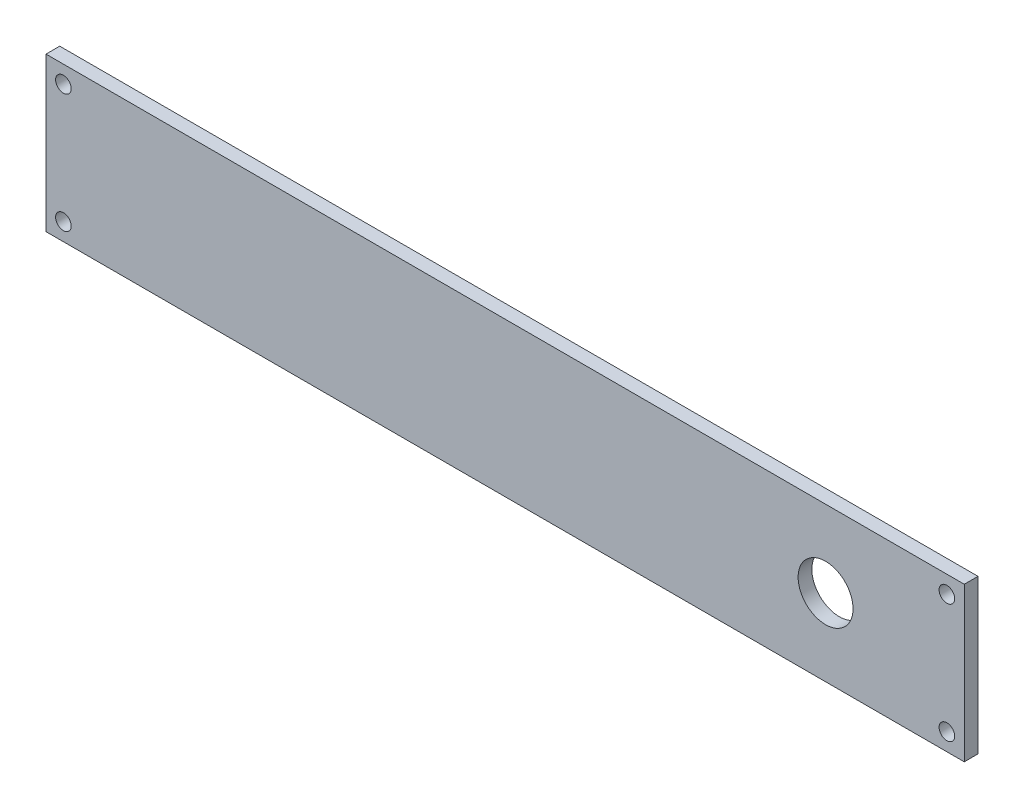
ISO-10303-21;
HEADER;
FILE_DESCRIPTION(('STEP AP214'),'2;1');
FILE_NAME('part.step','',(''),(''),'','','');
FILE_SCHEMA(('AUTOMOTIVE_DESIGN { 1 0 10303 214 1 1 1 1 }'));
ENDSEC;
DATA;
#1=APPLICATION_CONTEXT('core data for automotive mechanical design processes');
#2=APPLICATION_PROTOCOL_DEFINITION('international standard','automotive_design',2000,#1);
#3=PRODUCT_CONTEXT('',#1,'mechanical');
#4=PRODUCT('Part','Part','',(#3));
#5=PRODUCT_RELATED_PRODUCT_CATEGORY('part','',(#4));
#6=PRODUCT_DEFINITION_FORMATION('','',#4);
#7=PRODUCT_DEFINITION_CONTEXT('part definition',#1,'design');
#8=PRODUCT_DEFINITION('design','',#6,#7);
#9=PRODUCT_DEFINITION_SHAPE('','',#8);
#10=(LENGTH_UNIT() NAMED_UNIT(*) SI_UNIT(.MILLI.,.METRE.));
#11=(NAMED_UNIT(*) PLANE_ANGLE_UNIT() SI_UNIT($,.RADIAN.));
#12=(NAMED_UNIT(*) SI_UNIT($,.STERADIAN.) SOLID_ANGLE_UNIT());
#13=UNCERTAINTY_MEASURE_WITH_UNIT(LENGTH_MEASURE(1.E-05),#10,'distance_accuracy_value','');
#14=(GEOMETRIC_REPRESENTATION_CONTEXT(3) GLOBAL_UNCERTAINTY_ASSIGNED_CONTEXT((#13)) GLOBAL_UNIT_ASSIGNED_CONTEXT((#10,
#11,#12)) REPRESENTATION_CONTEXT('',''));
#15=CARTESIAN_POINT('',(0.,0.,0.));
#16=DIRECTION('',(0.,0.,1.));
#17=DIRECTION('',(1.,0.,0.));
#18=AXIS2_PLACEMENT_3D('',#15,#16,#17);
#19=CARTESIAN_POINT('',(96.5,-186.8,6.74999999999996));
#20=DIRECTION('',(0.,0.,1.));
#21=DIRECTION('',(0.,-1.,0.));
#22=AXIS2_PLACEMENT_3D('',#19,#20,#21);
#23=PLANE('',#22);
#24=CARTESIAN_POINT('',(70.,-199.8,6.74999999999996));
#25=DIRECTION('',(0.,0.,1.));
#26=DIRECTION('',(0.,-1.,0.));
#27=AXIS2_PLACEMENT_3D('',#24,#25,#26);
#28=CIRCLE('',#27,6.);
#29=CARTESIAN_POINT('',(70.,-205.8,6.74999999999996));
#30=VERTEX_POINT('',#29);
#31=EDGE_CURVE('E139',#30,#30,#28,.T.);
#32=ORIENTED_EDGE('',*,*,#31,.F.);
#33=EDGE_LOOP('',(#32));
#34=FACE_BOUND('',#33,.T.);
#35=CARTESIAN_POINT('',(96.5,-212.8,6.74999999999996));
#36=DIRECTION('',(0.,0.,1.));
#37=DIRECTION('',(0.,-1.,0.));
#38=AXIS2_PLACEMENT_3D('',#35,#36,#37);
#39=CIRCLE('',#38,1.7);
#40=CARTESIAN_POINT('',(96.5,-214.5,6.74999999999996));
#41=VERTEX_POINT('',#40);
#42=EDGE_CURVE('E105',#41,#41,#39,.T.);
#43=ORIENTED_EDGE('',*,*,#42,.F.);
#44=EDGE_LOOP('',(#43));
#45=FACE_BOUND('',#44,.T.);
#46=CARTESIAN_POINT('',(-96.5,-212.8,6.74999999999996));
#47=DIRECTION('',(0.,0.,1.));
#48=DIRECTION('',(0.,-1.,0.));
#49=AXIS2_PLACEMENT_3D('',#46,#47,#48);
#50=CIRCLE('',#49,1.7);
#51=CARTESIAN_POINT('',(-96.5,-214.5,6.74999999999996));
#52=VERTEX_POINT('',#51);
#53=EDGE_CURVE('E122',#52,#52,#50,.T.);
#54=ORIENTED_EDGE('',*,*,#53,.F.);
#55=EDGE_LOOP('',(#54));
#56=FACE_BOUND('',#55,.T.);
#57=CARTESIAN_POINT('',(-96.5,-186.8,6.74999999999996));
#58=DIRECTION('',(0.,0.,1.));
#59=DIRECTION('',(0.,-1.,0.));
#60=AXIS2_PLACEMENT_3D('',#57,#58,#59);
#61=CIRCLE('',#60,1.7);
#62=CARTESIAN_POINT('',(-96.5,-188.5,6.74999999999996));
#63=VERTEX_POINT('',#62);
#64=EDGE_CURVE('E125',#63,#63,#61,.T.);
#65=ORIENTED_EDGE('',*,*,#64,.F.);
#66=EDGE_LOOP('',(#65));
#67=FACE_BOUND('',#66,.T.);
#68=CARTESIAN_POINT('',(96.5,-186.8,6.74999999999996));
#69=DIRECTION('',(0.,0.,1.));
#70=DIRECTION('',(0.,-1.,0.));
#71=AXIS2_PLACEMENT_3D('',#68,#69,#70);
#72=CIRCLE('',#71,1.7);
#73=CARTESIAN_POINT('',(96.5,-188.5,6.74999999999996));
#74=VERTEX_POINT('',#73);
#75=EDGE_CURVE('E128',#74,#74,#72,.T.);
#76=ORIENTED_EDGE('',*,*,#75,.F.);
#77=EDGE_LOOP('',(#76));
#78=FACE_BOUND('',#77,.T.);
#79=DIRECTION('',(-1.,0.,0.));
#80=VECTOR('',#79,1.);
#81=CARTESIAN_POINT('',(100.3,-216.6,6.74999999999995));
#82=LINE('',#81,#80);
#83=CARTESIAN_POINT('',(100.3,-216.6,6.74999999999994));
#84=VERTEX_POINT('',#83);
#85=CARTESIAN_POINT('',(-100.3,-216.6,6.74999999999995));
#86=VERTEX_POINT('',#85);
#87=EDGE_CURVE('E51',#84,#86,#82,.T.);
#88=ORIENTED_EDGE('',*,*,#87,.F.);
#89=DIRECTION('',(0.,-1.,0.));
#90=VECTOR('',#89,1.);
#91=CARTESIAN_POINT('',(100.3,-183.,6.74999999999995));
#92=LINE('',#91,#90);
#93=CARTESIAN_POINT('',(100.3,-183.,6.74999999999995));
#94=VERTEX_POINT('',#93);
#95=EDGE_CURVE('E74',#94,#84,#92,.T.);
#96=ORIENTED_EDGE('',*,*,#95,.F.);
#97=DIRECTION('',(1.,0.,0.));
#98=VECTOR('',#97,1.);
#99=CARTESIAN_POINT('',(-100.3,-183.,6.74999999999995));
#100=LINE('',#99,#98);
#101=CARTESIAN_POINT('',(-100.3,-183.,6.74999999999995));
#102=VERTEX_POINT('',#101);
#103=EDGE_CURVE('E79',#102,#94,#100,.T.);
#104=ORIENTED_EDGE('',*,*,#103,.F.);
#105=DIRECTION('',(0.,1.,0.));
#106=VECTOR('',#105,1.);
#107=CARTESIAN_POINT('',(-100.3,-216.6,6.74999999999995));
#108=LINE('',#107,#106);
#109=EDGE_CURVE('E94',#86,#102,#108,.T.);
#110=ORIENTED_EDGE('',*,*,#109,.F.);
#111=EDGE_LOOP('',(#88,#96,#104,#110));
#112=FACE_BOUND('',#111,.T.);
#113=ADVANCED_FACE('F43',(#34,#45,#56,#67,#78,#112),#23,.T.);
#114=CARTESIAN_POINT('',(0.,0.,3.74999999999999));
#115=DIRECTION('',(0.,0.,-1.));
#116=DIRECTION('',(0.,1.,0.));
#117=AXIS2_PLACEMENT_3D('',#114,#115,#116);
#118=PLANE('',#117);
#119=CARTESIAN_POINT('',(70.,-199.8,3.74999999999996));
#120=DIRECTION('',(0.,0.,-1.));
#121=DIRECTION('',(0.,1.,0.));
#122=AXIS2_PLACEMENT_3D('',#119,#120,#121);
#123=CIRCLE('',#122,6.);
#124=CARTESIAN_POINT('',(70.,-193.8,3.74999999999996));
#125=VERTEX_POINT('',#124);
#126=EDGE_CURVE('E146',#125,#125,#123,.T.);
#127=ORIENTED_EDGE('',*,*,#126,.F.);
#128=EDGE_LOOP('',(#127));
#129=FACE_BOUND('',#128,.T.);
#130=CARTESIAN_POINT('',(96.5,-212.8,3.74999999999996));
#131=DIRECTION('',(0.,0.,-1.));
#132=DIRECTION('',(0.,1.,0.));
#133=AXIS2_PLACEMENT_3D('',#130,#131,#132);
#134=CIRCLE('',#133,1.7);
#135=CARTESIAN_POINT('',(96.5,-211.1,3.74999999999996));
#136=VERTEX_POINT('',#135);
#137=EDGE_CURVE('E135',#136,#136,#134,.T.);
#138=ORIENTED_EDGE('',*,*,#137,.F.);
#139=EDGE_LOOP('',(#138));
#140=FACE_BOUND('',#139,.T.);
#141=CARTESIAN_POINT('',(-96.5,-212.8,3.74999999999996));
#142=DIRECTION('',(0.,0.,-1.));
#143=DIRECTION('',(0.,1.,0.));
#144=AXIS2_PLACEMENT_3D('',#141,#142,#143);
#145=CIRCLE('',#144,1.7);
#146=CARTESIAN_POINT('',(-96.5,-211.1,3.74999999999996));
#147=VERTEX_POINT('',#146);
#148=EDGE_CURVE('E138',#147,#147,#145,.T.);
#149=ORIENTED_EDGE('',*,*,#148,.F.);
#150=EDGE_LOOP('',(#149));
#151=FACE_BOUND('',#150,.T.);
#152=CARTESIAN_POINT('',(-96.5,-186.8,3.74999999999996));
#153=DIRECTION('',(0.,0.,-1.));
#154=DIRECTION('',(0.,1.,0.));
#155=AXIS2_PLACEMENT_3D('',#152,#153,#154);
#156=CIRCLE('',#155,1.7);
#157=CARTESIAN_POINT('',(-96.5,-185.1,3.74999999999996));
#158=VERTEX_POINT('',#157);
#159=EDGE_CURVE('E134',#158,#158,#156,.T.);
#160=ORIENTED_EDGE('',*,*,#159,.F.);
#161=EDGE_LOOP('',(#160));
#162=FACE_BOUND('',#161,.T.);
#163=CARTESIAN_POINT('',(96.5,-186.8,3.74999999999996));
#164=DIRECTION('',(0.,0.,-1.));
#165=DIRECTION('',(0.,1.,0.));
#166=AXIS2_PLACEMENT_3D('',#163,#164,#165);
#167=CIRCLE('',#166,1.7);
#168=CARTESIAN_POINT('',(96.5,-185.1,3.74999999999996));
#169=VERTEX_POINT('',#168);
#170=EDGE_CURVE('E131',#169,#169,#167,.T.);
#171=ORIENTED_EDGE('',*,*,#170,.F.);
#172=EDGE_LOOP('',(#171));
#173=FACE_BOUND('',#172,.T.);
#174=DIRECTION('',(-1.,0.,0.));
#175=VECTOR('',#174,1.);
#176=CARTESIAN_POINT('',(100.3,-216.6,3.74999999999996));
#177=LINE('',#176,#175);
#178=CARTESIAN_POINT('',(100.3,-216.6,3.74999999999996));
#179=VERTEX_POINT('',#178);
#180=CARTESIAN_POINT('',(-100.3,-216.6,3.74999999999996));
#181=VERTEX_POINT('',#180);
#182=EDGE_CURVE('E103',#179,#181,#177,.T.);
#183=ORIENTED_EDGE('',*,*,#182,.T.);
#184=DIRECTION('',(0.,1.,0.));
#185=VECTOR('',#184,1.);
#186=CARTESIAN_POINT('',(-100.3,-216.6,3.74999999999996));
#187=LINE('',#186,#185);
#188=CARTESIAN_POINT('',(-100.3,-183.,3.74999999999996));
#189=VERTEX_POINT('',#188);
#190=EDGE_CURVE('E92',#181,#189,#187,.T.);
#191=ORIENTED_EDGE('',*,*,#190,.T.);
#192=DIRECTION('',(1.,0.,0.));
#193=VECTOR('',#192,1.);
#194=CARTESIAN_POINT('',(-100.3,-183.,3.74999999999996));
#195=LINE('',#194,#193);
#196=CARTESIAN_POINT('',(100.3,-183.,3.74999999999996));
#197=VERTEX_POINT('',#196);
#198=EDGE_CURVE('E95',#189,#197,#195,.T.);
#199=ORIENTED_EDGE('',*,*,#198,.T.);
#200=DIRECTION('',(0.,-1.,0.));
#201=VECTOR('',#200,1.);
#202=CARTESIAN_POINT('',(100.3,-183.,3.74999999999996));
#203=LINE('',#202,#201);
#204=EDGE_CURVE('E100',#197,#179,#203,.T.);
#205=ORIENTED_EDGE('',*,*,#204,.T.);
#206=EDGE_LOOP('',(#183,#191,#199,#205));
#207=FACE_BOUND('',#206,.T.);
#208=ADVANCED_FACE('F102',(#129,#140,#151,#162,#173,#207),#118,.T.);
#209=CARTESIAN_POINT('',(-100.3,-216.6,210.144493534117));
#210=DIRECTION('',(-1.,0.,0.));
#211=DIRECTION('',(0.,0.,1.));
#212=AXIS2_PLACEMENT_3D('',#209,#210,#211);
#213=PLANE('',#212);
#214=DIRECTION('',(0.,0.,-1.));
#215=VECTOR('',#214,1.);
#216=CARTESIAN_POINT('',(-100.3,-216.6,210.144493534117));
#217=LINE('',#216,#215);
#218=EDGE_CURVE('E11',#86,#181,#217,.T.);
#219=ORIENTED_EDGE('',*,*,#218,.F.);
#220=ORIENTED_EDGE('',*,*,#109,.T.);
#221=DIRECTION('',(0.,0.,-1.));
#222=VECTOR('',#221,1.);
#223=CARTESIAN_POINT('',(-100.3,-183.,210.144493534117));
#224=LINE('',#223,#222);
#225=EDGE_CURVE('E89',#102,#189,#224,.T.);
#226=ORIENTED_EDGE('',*,*,#225,.T.);
#227=ORIENTED_EDGE('',*,*,#190,.F.);
#228=EDGE_LOOP('',(#219,#220,#226,#227));
#229=FACE_BOUND('',#228,.T.);
#230=ADVANCED_FACE('F90',(#229),#213,.T.);
#231=CARTESIAN_POINT('',(-100.3,-183.,210.144493534117));
#232=DIRECTION('',(0.,1.,0.));
#233=DIRECTION('',(0.,0.,1.));
#234=AXIS2_PLACEMENT_3D('',#231,#232,#233);
#235=PLANE('',#234);
#236=ORIENTED_EDGE('',*,*,#225,.F.);
#237=ORIENTED_EDGE('',*,*,#103,.T.);
#238=DIRECTION('',(0.,0.,-1.));
#239=VECTOR('',#238,1.);
#240=CARTESIAN_POINT('',(100.3,-183.,210.144493534117));
#241=LINE('',#240,#239);
#242=EDGE_CURVE('E84',#94,#197,#241,.T.);
#243=ORIENTED_EDGE('',*,*,#242,.T.);
#244=ORIENTED_EDGE('',*,*,#198,.F.);
#245=EDGE_LOOP('',(#236,#237,#243,#244));
#246=FACE_BOUND('',#245,.T.);
#247=ADVANCED_FACE('F96',(#246),#235,.T.);
#248=CARTESIAN_POINT('',(100.3,-183.,210.144493534117));
#249=DIRECTION('',(1.,0.,0.));
#250=DIRECTION('',(0.,0.,-1.));
#251=AXIS2_PLACEMENT_3D('',#248,#249,#250);
#252=PLANE('',#251);
#253=ORIENTED_EDGE('',*,*,#242,.F.);
#254=ORIENTED_EDGE('',*,*,#95,.T.);
#255=DIRECTION('',(0.,0.,-1.));
#256=VECTOR('',#255,1.);
#257=CARTESIAN_POINT('',(100.3,-216.6,210.144493534117));
#258=LINE('',#257,#256);
#259=EDGE_CURVE('E111',#84,#179,#258,.T.);
#260=ORIENTED_EDGE('',*,*,#259,.T.);
#261=ORIENTED_EDGE('',*,*,#204,.F.);
#262=EDGE_LOOP('',(#253,#254,#260,#261));
#263=FACE_BOUND('',#262,.T.);
#264=ADVANCED_FACE('F117',(#263),#252,.T.);
#265=CARTESIAN_POINT('',(100.3,-216.6,210.144493534117));
#266=DIRECTION('',(0.,-1.,0.));
#267=DIRECTION('',(0.,0.,-1.));
#268=AXIS2_PLACEMENT_3D('',#265,#266,#267);
#269=PLANE('',#268);
#270=ORIENTED_EDGE('',*,*,#259,.F.);
#271=ORIENTED_EDGE('',*,*,#87,.T.);
#272=ORIENTED_EDGE('',*,*,#218,.T.);
#273=ORIENTED_EDGE('',*,*,#182,.F.);
#274=EDGE_LOOP('',(#270,#271,#272,#273));
#275=FACE_BOUND('',#274,.T.);
#276=ADVANCED_FACE('F118',(#275),#269,.T.);
#277=CARTESIAN_POINT('',(96.5,-186.8,34.75));
#278=DIRECTION('',(0.,0.,-1.));
#279=DIRECTION('',(0.,1.,0.));
#280=AXIS2_PLACEMENT_3D('',#277,#278,#279);
#281=CYLINDRICAL_SURFACE('',#280,1.7);
#282=ORIENTED_EDGE('',*,*,#75,.T.);
#283=EDGE_LOOP('',(#282));
#284=FACE_BOUND('',#283,.T.);
#285=ORIENTED_EDGE('',*,*,#170,.T.);
#286=EDGE_LOOP('',(#285));
#287=FACE_BOUND('',#286,.T.);
#288=ADVANCED_FACE('F163',(#284,#287),#281,.F.);
#289=CARTESIAN_POINT('',(-96.5,-186.8,34.75));
#290=DIRECTION('',(0.,0.,-1.));
#291=DIRECTION('',(0.,1.,0.));
#292=AXIS2_PLACEMENT_3D('',#289,#290,#291);
#293=CYLINDRICAL_SURFACE('',#292,1.7);
#294=ORIENTED_EDGE('',*,*,#64,.T.);
#295=EDGE_LOOP('',(#294));
#296=FACE_BOUND('',#295,.T.);
#297=ORIENTED_EDGE('',*,*,#159,.T.);
#298=EDGE_LOOP('',(#297));
#299=FACE_BOUND('',#298,.T.);
#300=ADVANCED_FACE('F165',(#296,#299),#293,.F.);
#301=CARTESIAN_POINT('',(-96.5,-212.8,34.75));
#302=DIRECTION('',(0.,0.,-1.));
#303=DIRECTION('',(0.,1.,0.));
#304=AXIS2_PLACEMENT_3D('',#301,#302,#303);
#305=CYLINDRICAL_SURFACE('',#304,1.7);
#306=ORIENTED_EDGE('',*,*,#53,.T.);
#307=EDGE_LOOP('',(#306));
#308=FACE_BOUND('',#307,.T.);
#309=ORIENTED_EDGE('',*,*,#148,.T.);
#310=EDGE_LOOP('',(#309));
#311=FACE_BOUND('',#310,.T.);
#312=ADVANCED_FACE('F173',(#308,#311),#305,.F.);
#313=CARTESIAN_POINT('',(96.5,-212.8,34.75));
#314=DIRECTION('',(0.,0.,-1.));
#315=DIRECTION('',(0.,1.,0.));
#316=AXIS2_PLACEMENT_3D('',#313,#314,#315);
#317=CYLINDRICAL_SURFACE('',#316,1.7);
#318=ORIENTED_EDGE('',*,*,#42,.T.);
#319=EDGE_LOOP('',(#318));
#320=FACE_BOUND('',#319,.T.);
#321=ORIENTED_EDGE('',*,*,#137,.T.);
#322=EDGE_LOOP('',(#321));
#323=FACE_BOUND('',#322,.T.);
#324=ADVANCED_FACE('F196',(#320,#323),#317,.F.);
#325=CARTESIAN_POINT('',(70.,-199.8,7.74999999999995));
#326=DIRECTION('',(0.,0.,-1.));
#327=DIRECTION('',(0.,1.,0.));
#328=AXIS2_PLACEMENT_3D('',#325,#326,#327);
#329=CYLINDRICAL_SURFACE('',#328,6.);
#330=ORIENTED_EDGE('',*,*,#31,.T.);
#331=EDGE_LOOP('',(#330));
#332=FACE_BOUND('',#331,.T.);
#333=ORIENTED_EDGE('',*,*,#126,.T.);
#334=EDGE_LOOP('',(#333));
#335=FACE_BOUND('',#334,.T.);
#336=ADVANCED_FACE('F150',(#332,#335),#329,.F.);
#337=CLOSED_SHELL('',(#113,#208,#230,#247,#264,#276,#288,#300,#312,#324,#336));
#338=MANIFOLD_SOLID_BREP('B2',#337);
#339=ADVANCED_BREP_SHAPE_REPRESENTATION('',(#18,#338),#14);
#340=SHAPE_DEFINITION_REPRESENTATION(#9,#339);
ENDSEC;
END-ISO-10303-21;
